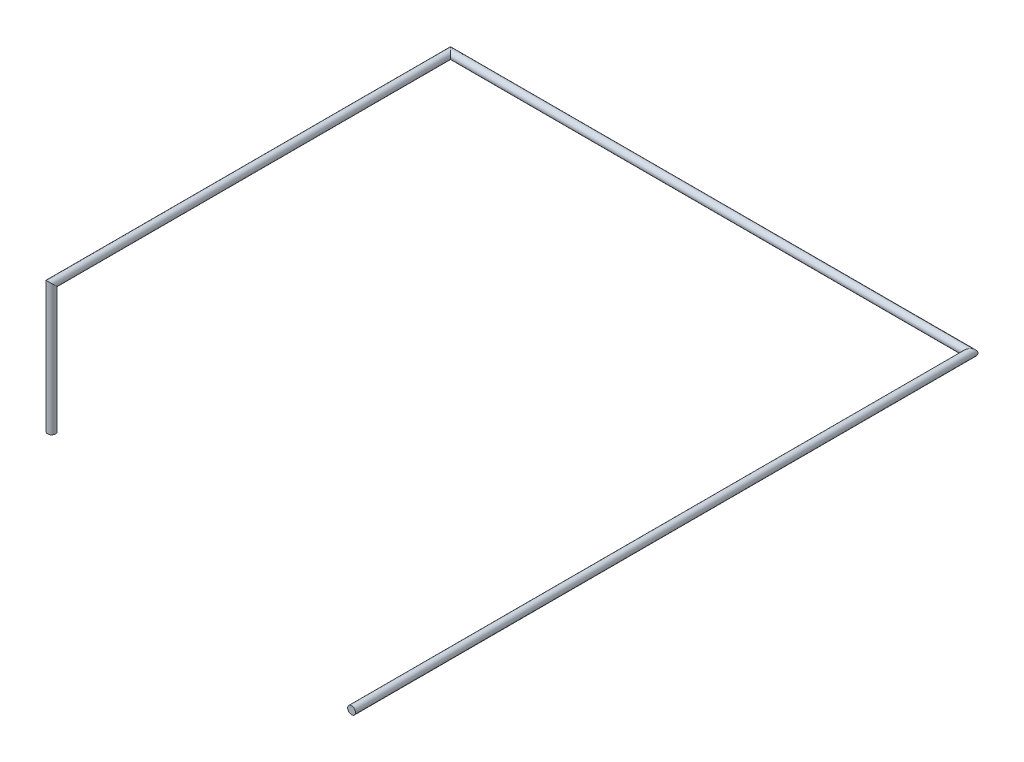
ISO-10303-21;
HEADER;
FILE_DESCRIPTION(('STEP AP214'),'2;1');
FILE_NAME('part.step','',(''),(''),'','','');
FILE_SCHEMA(('AUTOMOTIVE_DESIGN { 1 0 10303 214 1 1 1 1 }'));
ENDSEC;
DATA;
#1=APPLICATION_CONTEXT('core data for automotive mechanical design processes');
#2=APPLICATION_PROTOCOL_DEFINITION('international standard','automotive_design',2000,#1);
#3=PRODUCT_CONTEXT('',#1,'mechanical');
#4=PRODUCT('Part','Part','',(#3));
#5=PRODUCT_RELATED_PRODUCT_CATEGORY('part','',(#4));
#6=PRODUCT_DEFINITION_FORMATION('','',#4);
#7=PRODUCT_DEFINITION_CONTEXT('part definition',#1,'design');
#8=PRODUCT_DEFINITION('design','',#6,#7);
#9=PRODUCT_DEFINITION_SHAPE('','',#8);
#10=(LENGTH_UNIT() NAMED_UNIT(*) SI_UNIT(.MILLI.,.METRE.));
#11=(NAMED_UNIT(*) PLANE_ANGLE_UNIT() SI_UNIT($,.RADIAN.));
#12=(NAMED_UNIT(*) SI_UNIT($,.STERADIAN.) SOLID_ANGLE_UNIT());
#13=UNCERTAINTY_MEASURE_WITH_UNIT(LENGTH_MEASURE(1.E-05),#10,'distance_accuracy_value','');
#14=(GEOMETRIC_REPRESENTATION_CONTEXT(3) GLOBAL_UNCERTAINTY_ASSIGNED_CONTEXT((#13)) GLOBAL_UNIT_ASSIGNED_CONTEXT((#10,
#11,#12)) REPRESENTATION_CONTEXT('',''));
#15=CARTESIAN_POINT('',(0.,0.,0.));
#16=DIRECTION('',(0.,0.,1.));
#17=DIRECTION('',(1.,0.,0.));
#18=AXIS2_PLACEMENT_3D('',#15,#16,#17);
#19=CARTESIAN_POINT('',(0.,10.,0.));
#20=DIRECTION('',(0.,-1.,0.));
#21=DIRECTION('',(0.,0.,-1.));
#22=AXIS2_PLACEMENT_3D('',#19,#20,#21);
#23=CYLINDRICAL_SURFACE('',#22,12.7);
#24=CARTESIAN_POINT('',(0.,0.999999999999999,0.));
#25=DIRECTION('',(0.,1.,0.));
#26=DIRECTION('',(0.,0.,1.));
#27=AXIS2_PLACEMENT_3D('',#24,#25,#26);
#28=CIRCLE('',#27,12.7);
#29=CARTESIAN_POINT('',(-0.816559738579074,0.999999999999999,12.6737220339303));
#30=VERTEX_POINT('',#29);
#31=CARTESIAN_POINT('',(0.816559738579074,0.999999999999999,12.6737220339303));
#32=VERTEX_POINT('',#31);
#33=EDGE_CURVE('E11',#30,#32,#28,.T.);
#34=ORIENTED_EDGE('',*,*,#33,.T.);
#35=DIRECTION('',(0.,-1.,0.));
#36=VECTOR('',#35,1.);
#37=CARTESIAN_POINT('',(0.816559738579074,10.,12.6737220339303));
#38=LINE('',#37,#36);
#39=CARTESIAN_POINT('',(0.816559738579074,0.,12.6737220339303));
#40=VERTEX_POINT('',#39);
#41=EDGE_CURVE('E89',#32,#40,#38,.T.);
#42=ORIENTED_EDGE('',*,*,#41,.T.);
#43=CARTESIAN_POINT('',(0.,0.,0.));
#44=DIRECTION('',(0.,1.,0.));
#45=DIRECTION('',(0.,0.,1.));
#46=AXIS2_PLACEMENT_3D('',#43,#44,#45);
#47=CIRCLE('',#46,12.7);
#48=CARTESIAN_POINT('',(-0.816559738579074,0.,12.6737220339303));
#49=VERTEX_POINT('',#48);
#50=EDGE_CURVE('E41',#40,#49,#47,.T.);
#51=ORIENTED_EDGE('',*,*,#50,.T.);
#52=DIRECTION('',(0.,-1.,0.));
#53=VECTOR('',#52,1.);
#54=CARTESIAN_POINT('',(-0.816559738579074,10.,12.6737220339303));
#55=LINE('',#54,#53);
#56=EDGE_CURVE('E51',#49,#30,#55,.F.);
#57=ORIENTED_EDGE('',*,*,#56,.T.);
#58=EDGE_LOOP('',(#34,#42,#51,#57));
#59=FACE_BOUND('',#58,.T.);
#60=CARTESIAN_POINT('',(0.,415.,0.));
#61=DIRECTION('',(0.,0.707106781186548,-0.707106781186548));
#62=DIRECTION('',(0.,0.707106781186548,0.707106781186548));
#63=AXIS2_PLACEMENT_3D('',#60,#61,#62);
#64=ELLIPSE('',#63,17.9605122421383,12.7);
#65=CARTESIAN_POINT('',(0.,427.7,12.7));
#66=VERTEX_POINT('',#65);
#67=EDGE_CURVE('E118',#66,#66,#64,.F.);
#68=ORIENTED_EDGE('',*,*,#67,.T.);
#69=EDGE_LOOP('',(#68));
#70=FACE_BOUND('',#69,.T.);
#71=ADVANCED_FACE('F34',(#59,#70),#23,.T.);
#72=CARTESIAN_POINT('',(0.,0.,0.));
#73=DIRECTION('',(0.,1.,0.));
#74=DIRECTION('',(0.,0.,1.));
#75=AXIS2_PLACEMENT_3D('',#72,#73,#74);
#76=PLANE('',#75);
#77=ORIENTED_EDGE('',*,*,#50,.F.);
#78=DIRECTION('',(0.,0.,1.));
#79=VECTOR('',#78,1.);
#80=CARTESIAN_POINT('',(0.816559738579074,0.,12.4573504386912));
#81=LINE('',#80,#79);
#82=CARTESIAN_POINT('',(0.816559738579074,0.,12.9426495613088));
#83=VERTEX_POINT('',#82);
#84=EDGE_CURVE('E109',#40,#83,#81,.T.);
#85=ORIENTED_EDGE('',*,*,#84,.T.);
#86=DIRECTION('',(-1.,0.,0.));
#87=VECTOR('',#86,1.);
#88=CARTESIAN_POINT('',(-0.816559738579074,0.,12.9426495613088));
#89=LINE('',#88,#87);
#90=CARTESIAN_POINT('',(-0.816559738579074,0.,12.9426495613088));
#91=VERTEX_POINT('',#90);
#92=EDGE_CURVE('E99',#83,#91,#89,.T.);
#93=ORIENTED_EDGE('',*,*,#92,.T.);
#94=DIRECTION('',(0.,0.,-1.));
#95=VECTOR('',#94,1.);
#96=CARTESIAN_POINT('',(-0.816559738579074,0.,12.4573504386912));
#97=LINE('',#96,#95);
#98=EDGE_CURVE('E93',#91,#49,#97,.T.);
#99=ORIENTED_EDGE('',*,*,#98,.T.);
#100=EDGE_LOOP('',(#77,#85,#93,#99));
#101=FACE_BOUND('',#100,.T.);
#102=ADVANCED_FACE('F132',(#101),#76,.F.);
#103=CARTESIAN_POINT('',(1680.,415.,710.));
#104=DIRECTION('',(0.,0.,1.));
#105=DIRECTION('',(0.,1.,0.));
#106=AXIS2_PLACEMENT_3D('',#103,#104,#105);
#107=PLANE('',#106);
#108=CARTESIAN_POINT('',(1680.,415.,710.));
#109=DIRECTION('',(0.,0.,1.));
#110=DIRECTION('',(0.,1.,0.));
#111=AXIS2_PLACEMENT_3D('',#108,#109,#110);
#112=CIRCLE('',#111,12.7);
#113=CARTESIAN_POINT('',(1680.,427.7,710.));
#114=VERTEX_POINT('',#113);
#115=EDGE_CURVE('E117',#114,#114,#112,.T.);
#116=ORIENTED_EDGE('',*,*,#115,.T.);
#117=EDGE_LOOP('',(#116));
#118=FACE_BOUND('',#117,.T.);
#119=ADVANCED_FACE('F134',(#118),#107,.T.);
#120=CARTESIAN_POINT('',(1680.,415.,-1318.04));
#121=DIRECTION('',(0.,0.,1.));
#122=DIRECTION('',(1.,0.,0.));
#123=AXIS2_PLACEMENT_3D('',#120,#121,#122);
#124=CYLINDRICAL_SURFACE('',#123,12.7);
#125=CARTESIAN_POINT('',(1680.,415.,-1290.));
#126=DIRECTION('',(0.707106781186547,0.,0.707106781186547));
#127=DIRECTION('',(0.707106781186548,0.,-0.707106781186548));
#128=AXIS2_PLACEMENT_3D('',#125,#126,#127);
#129=ELLIPSE('',#128,17.9605122421383,12.7);
#130=CARTESIAN_POINT('',(1692.7,415.,-1302.7));
#131=VERTEX_POINT('',#130);
#132=EDGE_CURVE('E124',#131,#131,#129,.F.);
#133=ORIENTED_EDGE('',*,*,#132,.F.);
#134=EDGE_LOOP('',(#133));
#135=FACE_BOUND('',#134,.T.);
#136=ORIENTED_EDGE('',*,*,#115,.F.);
#137=EDGE_LOOP('',(#136));
#138=FACE_BOUND('',#137,.T.);
#139=ADVANCED_FACE('F140',(#135,#138),#124,.T.);
#140=CARTESIAN_POINT('',(-28.0399999999998,415.,-1290.));
#141=DIRECTION('',(1.,0.,0.));
#142=DIRECTION('',(0.,0.,-1.));
#143=AXIS2_PLACEMENT_3D('',#140,#141,#142);
#144=CYLINDRICAL_SURFACE('',#143,12.7);
#145=CARTESIAN_POINT('',(0.,415.,-1290.));
#146=DIRECTION('',(0.707106781186548,0.,-0.707106781186548));
#147=DIRECTION('',(-0.707106781186548,0.,-0.707106781186548));
#148=AXIS2_PLACEMENT_3D('',#145,#146,#147);
#149=ELLIPSE('',#148,17.9605122421383,12.7);
#150=CARTESIAN_POINT('',(-12.7,415.,-1302.7));
#151=VERTEX_POINT('',#150);
#152=EDGE_CURVE('E121',#151,#151,#149,.F.);
#153=ORIENTED_EDGE('',*,*,#152,.F.);
#154=EDGE_LOOP('',(#153));
#155=FACE_BOUND('',#154,.T.);
#156=ORIENTED_EDGE('',*,*,#132,.T.);
#157=EDGE_LOOP('',(#156));
#158=FACE_BOUND('',#157,.T.);
#159=ADVANCED_FACE('F144',(#155,#158),#144,.T.);
#160=CARTESIAN_POINT('',(0.,415.,14.0699999999999));
#161=DIRECTION('',(0.,0.,-1.));
#162=DIRECTION('',(-1.,0.,0.));
#163=AXIS2_PLACEMENT_3D('',#160,#161,#162);
#164=CYLINDRICAL_SURFACE('',#163,12.7);
#165=ORIENTED_EDGE('',*,*,#67,.F.);
#166=EDGE_LOOP('',(#165));
#167=FACE_BOUND('',#166,.T.);
#168=ORIENTED_EDGE('',*,*,#152,.T.);
#169=EDGE_LOOP('',(#168));
#170=FACE_BOUND('',#169,.T.);
#171=ADVANCED_FACE('F135',(#167,#170),#164,.T.);
#172=CARTESIAN_POINT('',(0.816559738579074,1.,12.4573504386912));
#173=DIRECTION('',(1.,0.,0.));
#174=DIRECTION('',(0.,0.,-1.));
#175=AXIS2_PLACEMENT_3D('',#172,#173,#174);
#176=PLANE('',#175);
#177=ORIENTED_EDGE('',*,*,#41,.F.);
#178=DIRECTION('',(0.,0.,1.));
#179=VECTOR('',#178,1.);
#180=CARTESIAN_POINT('',(0.816559738579074,1.,12.4573504386912));
#181=LINE('',#180,#179);
#182=CARTESIAN_POINT('',(0.816559738579074,1.,12.9426495613088));
#183=VERTEX_POINT('',#182);
#184=EDGE_CURVE('E83',#32,#183,#181,.T.);
#185=ORIENTED_EDGE('',*,*,#184,.T.);
#186=DIRECTION('',(0.,-1.,0.));
#187=VECTOR('',#186,1.);
#188=CARTESIAN_POINT('',(0.816559738579074,1.,12.9426495613088));
#189=LINE('',#188,#187);
#190=EDGE_CURVE('E87',#183,#83,#189,.T.);
#191=ORIENTED_EDGE('',*,*,#190,.T.);
#192=ORIENTED_EDGE('',*,*,#84,.F.);
#193=EDGE_LOOP('',(#177,#185,#191,#192));
#194=FACE_BOUND('',#193,.T.);
#195=ADVANCED_FACE('F85',(#194),#176,.T.);
#196=CARTESIAN_POINT('',(-0.816559738579074,1.,12.4573504386912));
#197=DIRECTION('',(-1.,0.,0.));
#198=DIRECTION('',(0.,0.,1.));
#199=AXIS2_PLACEMENT_3D('',#196,#197,#198);
#200=PLANE('',#199);
#201=ORIENTED_EDGE('',*,*,#56,.F.);
#202=ORIENTED_EDGE('',*,*,#98,.F.);
#203=DIRECTION('',(0.,-1.,0.));
#204=VECTOR('',#203,1.);
#205=CARTESIAN_POINT('',(-0.816559738579074,1.,12.9426495613088));
#206=LINE('',#205,#204);
#207=CARTESIAN_POINT('',(-0.816559738579074,1.,12.9426495613088));
#208=VERTEX_POINT('',#207);
#209=EDGE_CURVE('E100',#208,#91,#206,.T.);
#210=ORIENTED_EDGE('',*,*,#209,.F.);
#211=DIRECTION('',(0.,0.,-1.));
#212=VECTOR('',#211,1.);
#213=CARTESIAN_POINT('',(-0.816559738579074,1.,12.4573504386912));
#214=LINE('',#213,#212);
#215=EDGE_CURVE('E101',#208,#30,#214,.T.);
#216=ORIENTED_EDGE('',*,*,#215,.T.);
#217=EDGE_LOOP('',(#201,#202,#210,#216));
#218=FACE_BOUND('',#217,.T.);
#219=ADVANCED_FACE('F131',(#218),#200,.T.);
#220=CARTESIAN_POINT('',(-0.816559738579074,1.,12.9426495613088));
#221=DIRECTION('',(0.,0.,1.));
#222=DIRECTION('',(1.,0.,0.));
#223=AXIS2_PLACEMENT_3D('',#220,#221,#222);
#224=PLANE('',#223);
#225=ORIENTED_EDGE('',*,*,#92,.F.);
#226=ORIENTED_EDGE('',*,*,#190,.F.);
#227=DIRECTION('',(-1.,0.,0.));
#228=VECTOR('',#227,1.);
#229=CARTESIAN_POINT('',(-0.816559738579074,1.,12.9426495613088));
#230=LINE('',#229,#228);
#231=EDGE_CURVE('E92',#183,#208,#230,.T.);
#232=ORIENTED_EDGE('',*,*,#231,.T.);
#233=ORIENTED_EDGE('',*,*,#209,.T.);
#234=EDGE_LOOP('',(#225,#226,#232,#233));
#235=FACE_BOUND('',#234,.T.);
#236=ADVANCED_FACE('F97',(#235),#224,.T.);
#237=CARTESIAN_POINT('',(0.,1.,0.));
#238=DIRECTION('',(0.,1.,0.));
#239=DIRECTION('',(0.,0.,1.));
#240=AXIS2_PLACEMENT_3D('',#237,#238,#239);
#241=PLANE('',#240);
#242=ORIENTED_EDGE('',*,*,#33,.F.);
#243=ORIENTED_EDGE('',*,*,#215,.F.);
#244=ORIENTED_EDGE('',*,*,#231,.F.);
#245=ORIENTED_EDGE('',*,*,#184,.F.);
#246=EDGE_LOOP('',(#242,#243,#244,#245));
#247=FACE_BOUND('',#246,.T.);
#248=ADVANCED_FACE('F104',(#247),#241,.T.);
#249=CLOSED_SHELL('',(#71,#102,#119,#139,#159,#171,#195,#219,#236,#248));
#250=MANIFOLD_SOLID_BREP('B2',#249);
#251=ADVANCED_BREP_SHAPE_REPRESENTATION('',(#18,#250),#14);
#252=SHAPE_DEFINITION_REPRESENTATION(#9,#251);
ENDSEC;
END-ISO-10303-21;
